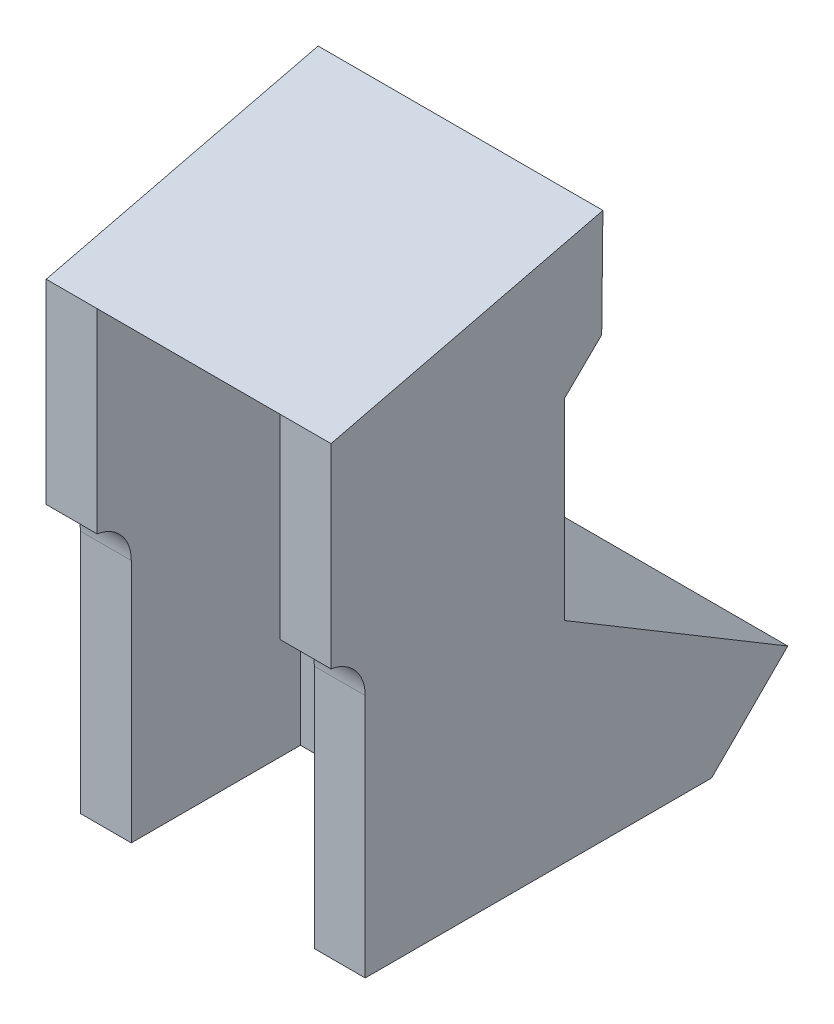
ISO-10303-21;
HEADER;
FILE_DESCRIPTION(('STEP AP214'),'2;1');
FILE_NAME('part.step','',(''),(''),'','','');
FILE_SCHEMA(('AUTOMOTIVE_DESIGN { 1 0 10303 214 1 1 1 1 }'));
ENDSEC;
DATA;
#1=APPLICATION_CONTEXT('core data for automotive mechanical design processes');
#2=APPLICATION_PROTOCOL_DEFINITION('international standard','automotive_design',2000,#1);
#3=PRODUCT_CONTEXT('',#1,'mechanical');
#4=PRODUCT('Part','Part','',(#3));
#5=PRODUCT_RELATED_PRODUCT_CATEGORY('part','',(#4));
#6=PRODUCT_DEFINITION_FORMATION('','',#4);
#7=PRODUCT_DEFINITION_CONTEXT('part definition',#1,'design');
#8=PRODUCT_DEFINITION('design','',#6,#7);
#9=PRODUCT_DEFINITION_SHAPE('','',#8);
#10=(LENGTH_UNIT() NAMED_UNIT(*) SI_UNIT(.MILLI.,.METRE.));
#11=(NAMED_UNIT(*) PLANE_ANGLE_UNIT() SI_UNIT($,.RADIAN.));
#12=(NAMED_UNIT(*) SI_UNIT($,.STERADIAN.) SOLID_ANGLE_UNIT());
#13=UNCERTAINTY_MEASURE_WITH_UNIT(LENGTH_MEASURE(1.E-05),#10,'distance_accuracy_value','');
#14=(GEOMETRIC_REPRESENTATION_CONTEXT(3) GLOBAL_UNCERTAINTY_ASSIGNED_CONTEXT((#13)) GLOBAL_UNIT_ASSIGNED_CONTEXT((#10,
#11,#12)) REPRESENTATION_CONTEXT('',''));
#15=CARTESIAN_POINT('',(0.,0.,0.));
#16=DIRECTION('',(0.,0.,1.));
#17=DIRECTION('',(1.,0.,0.));
#18=AXIS2_PLACEMENT_3D('',#15,#16,#17);
#19=CARTESIAN_POINT('',(14.,8.74131190937914,6.10391849047311));
#20=DIRECTION('',(0.,0.,-1.));
#21=DIRECTION('',(-1.,0.,0.));
#22=AXIS2_PLACEMENT_3D('',#19,#20,#21);
#23=PLANE('',#22);
#24=DIRECTION('',(-1.,0.,0.));
#25=VECTOR('',#24,1.);
#26=CARTESIAN_POINT('',(14.,-0.850340136054422,6.10391849047311));
#27=LINE('',#26,#25);
#28=CARTESIAN_POINT('',(2.5,-0.850340136054423,6.10391849047311));
#29=VERTEX_POINT('',#28);
#30=CARTESIAN_POINT('',(0.,-0.850340136054422,6.10391849047311));
#31=VERTEX_POINT('',#30);
#32=EDGE_CURVE('E241',#29,#31,#27,.T.);
#33=ORIENTED_EDGE('',*,*,#32,.F.);
#34=DIRECTION('',(0.,-1.,0.));
#35=VECTOR('',#34,1.);
#36=CARTESIAN_POINT('',(2.5,8.74131190937914,6.10391849047311));
#37=LINE('',#36,#35);
#38=CARTESIAN_POINT('',(2.5,8.74131190937914,6.10391849047311));
#39=VERTEX_POINT('',#38);
#40=EDGE_CURVE('E187',#39,#29,#37,.T.);
#41=ORIENTED_EDGE('',*,*,#40,.F.);
#42=DIRECTION('',(-1.,0.,0.));
#43=VECTOR('',#42,1.);
#44=CARTESIAN_POINT('',(14.,8.74131190937914,6.10391849047311));
#45=LINE('',#44,#43);
#46=CARTESIAN_POINT('',(0.,8.74131190937914,6.10391849047311));
#47=VERTEX_POINT('',#46);
#48=EDGE_CURVE('E245',#39,#47,#45,.T.);
#49=ORIENTED_EDGE('',*,*,#48,.T.);
#50=DIRECTION('',(0.,-1.,0.));
#51=VECTOR('',#50,1.);
#52=CARTESIAN_POINT('',(0.,8.74131190937914,6.10391849047311));
#53=LINE('',#52,#51);
#54=EDGE_CURVE('E202',#47,#31,#53,.T.);
#55=ORIENTED_EDGE('',*,*,#54,.T.);
#56=EDGE_LOOP('',(#33,#41,#49,#55));
#57=FACE_BOUND('',#56,.T.);
#58=ADVANCED_FACE('F41',(#57),#23,.F.);
#59=CARTESIAN_POINT('',(14.,-0.850340136054422,4.42176870748299));
#60=DIRECTION('',(0.,0.,-1.));
#61=DIRECTION('',(0.,1.,0.));
#62=AXIS2_PLACEMENT_3D('',#59,#60,#61);
#63=PLANE('',#62);
#64=DIRECTION('',(0.,1.,0.));
#65=VECTOR('',#64,1.);
#66=CARTESIAN_POINT('',(2.5,-0.850340136054424,4.42176870748299));
#67=LINE('',#66,#65);
#68=CARTESIAN_POINT('',(2.5,-14.8503401360544,4.42176870748299));
#69=VERTEX_POINT('',#68);
#70=CARTESIAN_POINT('',(2.5,-2.82492141813596,4.42176870748299));
#71=VERTEX_POINT('',#70);
#72=EDGE_CURVE('E161',#69,#71,#67,.T.);
#73=ORIENTED_EDGE('',*,*,#72,.T.);
#74=DIRECTION('',(-1.,0.,0.));
#75=VECTOR('',#74,1.);
#76=CARTESIAN_POINT('',(14.,-2.82492141813596,4.42176870748299));
#77=LINE('',#76,#75);
#78=CARTESIAN_POINT('',(0.,-2.82492141813596,4.42176870748299));
#79=VERTEX_POINT('',#78);
#80=EDGE_CURVE('E249',#71,#79,#77,.T.);
#81=ORIENTED_EDGE('',*,*,#80,.T.);
#82=DIRECTION('',(0.,-1.,0.));
#83=VECTOR('',#82,1.);
#84=CARTESIAN_POINT('',(0.,-0.850340136054422,4.42176870748299));
#85=LINE('',#84,#83);
#86=CARTESIAN_POINT('',(0.,-14.8503401360544,4.42176870748299));
#87=VERTEX_POINT('',#86);
#88=EDGE_CURVE('E222',#79,#87,#85,.T.);
#89=ORIENTED_EDGE('',*,*,#88,.T.);
#90=DIRECTION('',(-1.,0.,0.));
#91=VECTOR('',#90,1.);
#92=CARTESIAN_POINT('',(14.,-14.8503401360544,4.42176870748299));
#93=LINE('',#92,#91);
#94=EDGE_CURVE('E238',#69,#87,#93,.T.);
#95=ORIENTED_EDGE('',*,*,#94,.F.);
#96=EDGE_LOOP('',(#73,#81,#89,#95));
#97=FACE_BOUND('',#96,.T.);
#98=ADVANCED_FACE('F298',(#97),#63,.F.);
#99=CARTESIAN_POINT('',(14.,8.74131190937914,6.10391849047311));
#100=VERTEX_POINT('',#99);
#101=CARTESIAN_POINT('',(11.5,8.74131190937914,6.10391849047311));
#102=VERTEX_POINT('',#101);
#103=EDGE_CURVE('E246',#100,#102,#45,.T.);
#104=ORIENTED_EDGE('',*,*,#103,.T.);
#105=DIRECTION('',(0.,1.,0.));
#106=VECTOR('',#105,1.);
#107=CARTESIAN_POINT('',(11.5,8.74131190937914,6.10391849047311));
#108=LINE('',#107,#106);
#109=CARTESIAN_POINT('',(11.5,-0.850340136054423,6.10391849047311));
#110=VERTEX_POINT('',#109);
#111=EDGE_CURVE('E189',#110,#102,#108,.T.);
#112=ORIENTED_EDGE('',*,*,#111,.F.);
#113=CARTESIAN_POINT('',(14.,-0.850340136054422,6.10391849047311));
#114=VERTEX_POINT('',#113);
#115=EDGE_CURVE('E242',#114,#110,#27,.T.);
#116=ORIENTED_EDGE('',*,*,#115,.F.);
#117=DIRECTION('',(0.,-1.,0.));
#118=VECTOR('',#117,1.);
#119=CARTESIAN_POINT('',(14.,8.74131190937914,6.10391849047311));
#120=LINE('',#119,#118);
#121=EDGE_CURVE('E205',#100,#114,#120,.T.);
#122=ORIENTED_EDGE('',*,*,#121,.F.);
#123=EDGE_LOOP('',(#104,#112,#116,#122));
#124=FACE_BOUND('',#123,.T.);
#125=ADVANCED_FACE('F328',(#124),#23,.F.);
#126=DIRECTION('',(0.,-1.,0.));
#127=VECTOR('',#126,1.);
#128=CARTESIAN_POINT('',(14.,-0.850340136054422,4.42176870748299));
#129=LINE('',#128,#127);
#130=CARTESIAN_POINT('',(14.,-2.82492141813596,4.42176870748299));
#131=VERTEX_POINT('',#130);
#132=CARTESIAN_POINT('',(14.,-14.8503401360544,4.42176870748299));
#133=VERTEX_POINT('',#132);
#134=EDGE_CURVE('E208',#131,#133,#129,.T.);
#135=ORIENTED_EDGE('',*,*,#134,.F.);
#136=DIRECTION('',(-1.,0.,0.));
#137=VECTOR('',#136,1.);
#138=CARTESIAN_POINT('',(14.,-2.82492141813596,4.42176870748299));
#139=LINE('',#138,#137);
#140=CARTESIAN_POINT('',(11.5,-2.82492141813596,4.42176870748299));
#141=VERTEX_POINT('',#140);
#142=EDGE_CURVE('E252',#131,#141,#139,.T.);
#143=ORIENTED_EDGE('',*,*,#142,.T.);
#144=DIRECTION('',(0.,-1.,0.));
#145=VECTOR('',#144,1.);
#146=CARTESIAN_POINT('',(11.5,-0.850340136054422,4.42176870748299));
#147=LINE('',#146,#145);
#148=CARTESIAN_POINT('',(11.5,-14.8503401360544,4.42176870748299));
#149=VERTEX_POINT('',#148);
#150=EDGE_CURVE('E196',#141,#149,#147,.T.);
#151=ORIENTED_EDGE('',*,*,#150,.T.);
#152=EDGE_CURVE('E239',#133,#149,#93,.T.);
#153=ORIENTED_EDGE('',*,*,#152,.F.);
#154=EDGE_LOOP('',(#135,#143,#151,#153));
#155=FACE_BOUND('',#154,.T.);
#156=ADVANCED_FACE('F317',(#155),#63,.F.);
#157=CARTESIAN_POINT('',(14.,-14.8503401360544,-22.6052497412551));
#158=DIRECTION('',(0.,1.,0.));
#159=DIRECTION('',(0.,0.,1.));
#160=AXIS2_PLACEMENT_3D('',#157,#158,#159);
#161=PLANE('',#160);
#162=DIRECTION('',(0.,0.,-1.));
#163=VECTOR('',#162,1.);
#164=CARTESIAN_POINT('',(0.,-14.8503401360544,-22.6052497412551));
#165=LINE('',#164,#163);
#166=CARTESIAN_POINT('',(0.,-14.8503401360544,-12.6052497412551));
#167=VERTEX_POINT('',#166);
#168=EDGE_CURVE('E224',#87,#167,#165,.T.);
#169=ORIENTED_EDGE('',*,*,#168,.T.);
#170=DIRECTION('',(1.,0.,0.));
#171=VECTOR('',#170,1.);
#172=CARTESIAN_POINT('',(14.,-14.8503401360544,-12.6052497412551));
#173=LINE('',#172,#171);
#174=CARTESIAN_POINT('',(14.,-14.8503401360544,-12.6052497412551));
#175=VERTEX_POINT('',#174);
#176=EDGE_CURVE('E270',#167,#175,#173,.T.);
#177=ORIENTED_EDGE('',*,*,#176,.T.);
#178=DIRECTION('',(0.,0.,-1.));
#179=VECTOR('',#178,1.);
#180=CARTESIAN_POINT('',(14.,-14.8503401360544,-22.6052497412551));
#181=LINE('',#180,#179);
#182=EDGE_CURVE('E210',#133,#175,#181,.T.);
#183=ORIENTED_EDGE('',*,*,#182,.F.);
#184=ORIENTED_EDGE('',*,*,#152,.T.);
#185=DIRECTION('',(0.,0.,1.));
#186=VECTOR('',#185,1.);
#187=CARTESIAN_POINT('',(11.5,-14.8503401360544,-3.89608150952689));
#188=LINE('',#187,#186);
#189=CARTESIAN_POINT('',(11.5,-14.8503401360544,-3.89608150952689));
#190=VERTEX_POINT('',#189);
#191=EDGE_CURVE('E166',#190,#149,#188,.T.);
#192=ORIENTED_EDGE('',*,*,#191,.F.);
#193=DIRECTION('',(1.,0.,0.));
#194=VECTOR('',#193,1.);
#195=CARTESIAN_POINT('',(2.5,-14.8503401360544,-3.89608150952689));
#196=LINE('',#195,#194);
#197=CARTESIAN_POINT('',(2.5,-14.8503401360544,-3.89608150952689));
#198=VERTEX_POINT('',#197);
#199=EDGE_CURVE('E173',#198,#190,#196,.T.);
#200=ORIENTED_EDGE('',*,*,#199,.F.);
#201=DIRECTION('',(0.,0.,1.));
#202=VECTOR('',#201,1.);
#203=CARTESIAN_POINT('',(2.5,-14.8503401360544,-3.89608150952689));
#204=LINE('',#203,#202);
#205=EDGE_CURVE('E155',#198,#69,#204,.T.);
#206=ORIENTED_EDGE('',*,*,#205,.T.);
#207=ORIENTED_EDGE('',*,*,#94,.T.);
#208=EDGE_LOOP('',(#169,#177,#183,#184,#192,#200,#206,#207));
#209=FACE_BOUND('',#208,.T.);
#210=ADVANCED_FACE('F179',(#209),#161,.F.);
#211=CARTESIAN_POINT('',(14.,-4.52781626860019,-5.37414965986395));
#212=DIRECTION('',(0.,-0.857847135561487,0.513904944526662));
#213=DIRECTION('',(0.,-0.513904944526662,-0.857847135561487));
#214=AXIS2_PLACEMENT_3D('',#211,#212,#213);
#215=PLANE('',#214);
#216=DIRECTION('',(0.,0.513904944526662,0.857847135561487));
#217=VECTOR('',#216,1.);
#218=CARTESIAN_POINT('',(14.,-4.52781626860019,-5.37414965986395));
#219=LINE('',#218,#217);
#220=CARTESIAN_POINT('',(14.,-11.1040003127998,-16.3515895645098));
#221=VERTEX_POINT('',#220);
#222=CARTESIAN_POINT('',(14.,-4.52781626860019,-5.37414965986395));
#223=VERTEX_POINT('',#222);
#224=EDGE_CURVE('E213',#221,#223,#219,.T.);
#225=ORIENTED_EDGE('',*,*,#224,.F.);
#226=DIRECTION('',(-1.,0.,0.));
#227=VECTOR('',#226,1.);
#228=CARTESIAN_POINT('',(14.,-11.1040003127998,-16.3515895645098));
#229=LINE('',#228,#227);
#230=CARTESIAN_POINT('',(0.,-11.1040003127998,-16.3515895645098));
#231=VERTEX_POINT('',#230);
#232=EDGE_CURVE('E263',#221,#231,#229,.T.);
#233=ORIENTED_EDGE('',*,*,#232,.T.);
#234=DIRECTION('',(0.,0.513904944526662,0.857847135561487));
#235=VECTOR('',#234,1.);
#236=CARTESIAN_POINT('',(0.,-4.52781626860019,-5.37414965986395));
#237=LINE('',#236,#235);
#238=CARTESIAN_POINT('',(0.,-4.52781626860019,-5.37414965986395));
#239=VERTEX_POINT('',#238);
#240=EDGE_CURVE('E226',#231,#239,#237,.T.);
#241=ORIENTED_EDGE('',*,*,#240,.T.);
#242=DIRECTION('',(-1.,0.,0.));
#243=VECTOR('',#242,1.);
#244=CARTESIAN_POINT('',(14.,-4.52781626860019,-5.37414965986395));
#245=LINE('',#244,#243);
#246=EDGE_CURVE('E235',#223,#239,#245,.T.);
#247=ORIENTED_EDGE('',*,*,#246,.F.);
#248=EDGE_LOOP('',(#225,#233,#241,#247));
#249=FACE_BOUND('',#248,.T.);
#250=ADVANCED_FACE('F308',(#249),#215,.F.);
#251=CARTESIAN_POINT('',(14.,4.92796604432498,-5.37414965986395));
#252=DIRECTION('',(0.,0.,1.));
#253=DIRECTION('',(0.,-1.,0.));
#254=AXIS2_PLACEMENT_3D('',#251,#252,#253);
#255=PLANE('',#254);
#256=DIRECTION('',(0.,1.,0.));
#257=VECTOR('',#256,1.);
#258=CARTESIAN_POINT('',(0.,4.92796604432498,-5.37414965986395));
#259=LINE('',#258,#257);
#260=CARTESIAN_POINT('',(0.,4.92796604432498,-5.37414965986395));
#261=VERTEX_POINT('',#260);
#262=EDGE_CURVE('E228',#239,#261,#259,.T.);
#263=ORIENTED_EDGE('',*,*,#262,.T.);
#264=DIRECTION('',(-1.,0.,0.));
#265=VECTOR('',#264,1.);
#266=CARTESIAN_POINT('',(14.,4.92796604432498,-5.37414965986395));
#267=LINE('',#266,#265);
#268=CARTESIAN_POINT('',(14.,4.92796604432498,-5.37414965986395));
#269=VERTEX_POINT('',#268);
#270=EDGE_CURVE('E219',#269,#261,#267,.T.);
#271=ORIENTED_EDGE('',*,*,#270,.F.);
#272=DIRECTION('',(0.,1.,0.));
#273=VECTOR('',#272,1.);
#274=CARTESIAN_POINT('',(14.,4.92796604432498,-5.37414965986395));
#275=LINE('',#274,#273);
#276=EDGE_CURVE('E215',#223,#269,#275,.T.);
#277=ORIENTED_EDGE('',*,*,#276,.F.);
#278=ORIENTED_EDGE('',*,*,#246,.T.);
#279=EDGE_LOOP('',(#263,#271,#277,#278));
#280=FACE_BOUND('',#279,.T.);
#281=ADVANCED_FACE('F358',(#280),#255,.F.);
#282=CARTESIAN_POINT('',(14.,13.7074829931973,-14.3537414965986));
#283=DIRECTION('',(0.,0.71502770122186,0.699096121063035));
#284=DIRECTION('',(0.,-0.699096121063036,0.71502770122186));
#285=AXIS2_PLACEMENT_3D('',#282,#283,#284);
#286=PLANE('',#285);
#287=DIRECTION('',(0.,0.699096121063036,-0.71502770122186));
#288=VECTOR('',#287,1.);
#289=CARTESIAN_POINT('',(0.,13.7074829931973,-14.3537414965986));
#290=LINE('',#289,#288);
#291=CARTESIAN_POINT('',(0.,6.7165217825669,-7.20346448438));
#292=VERTEX_POINT('',#291);
#293=EDGE_CURVE('E230',#261,#292,#290,.T.);
#294=ORIENTED_EDGE('',*,*,#293,.T.);
#295=DIRECTION('',(1.,0.,0.));
#296=VECTOR('',#295,1.);
#297=CARTESIAN_POINT('',(14.,6.7165217825669,-7.20346448438));
#298=LINE('',#297,#296);
#299=CARTESIAN_POINT('',(14.,6.7165217825669,-7.20346448438));
#300=VERTEX_POINT('',#299);
#301=EDGE_CURVE('E11',#292,#300,#298,.T.);
#302=ORIENTED_EDGE('',*,*,#301,.T.);
#303=DIRECTION('',(0.,0.699096121063036,-0.71502770122186));
#304=VECTOR('',#303,1.);
#305=CARTESIAN_POINT('',(14.,13.7074829931973,-14.3537414965986));
#306=LINE('',#305,#304);
#307=EDGE_CURVE('E217',#269,#300,#306,.T.);
#308=ORIENTED_EDGE('',*,*,#307,.F.);
#309=ORIENTED_EDGE('',*,*,#270,.T.);
#310=EDGE_LOOP('',(#294,#302,#308,#309));
#311=FACE_BOUND('',#310,.T.);
#312=ADVANCED_FACE('F361',(#311),#286,.F.);
#313=CARTESIAN_POINT('',(14.,9.14965986394558,4.42176870748299));
#314=DIRECTION('',(0.,-0.971776769571021,-0.23590233174369));
#315=DIRECTION('',(0.,0.23590233174369,-0.971776769571022));
#316=AXIS2_PLACEMENT_3D('',#313,#314,#315);
#317=PLANE('',#316);
#318=DIRECTION('',(0.,-0.23590233174369,0.971776769571021));
#319=VECTOR('',#318,1.);
#320=CARTESIAN_POINT('',(14.,9.14965986394558,4.42176870748299));
#321=LINE('',#320,#319);
#322=CARTESIAN_POINT('',(14.,11.9861390747884,-7.26283222076515));
#323=VERTEX_POINT('',#322);
#324=EDGE_CURVE('E203',#323,#100,#321,.T.);
#325=ORIENTED_EDGE('',*,*,#324,.F.);
#326=DIRECTION('',(-1.,0.,0.));
#327=VECTOR('',#326,1.);
#328=CARTESIAN_POINT('',(14.,11.9861390747884,-7.26283222076515));
#329=LINE('',#328,#327);
#330=CARTESIAN_POINT('',(0.,11.9861390747884,-7.26283222076515));
#331=VERTEX_POINT('',#330);
#332=EDGE_CURVE('E50',#323,#331,#329,.T.);
#333=ORIENTED_EDGE('',*,*,#332,.T.);
#334=DIRECTION('',(0.,-0.23590233174369,0.971776769571021));
#335=VECTOR('',#334,1.);
#336=CARTESIAN_POINT('',(0.,9.14965986394558,4.42176870748299));
#337=LINE('',#336,#335);
#338=EDGE_CURVE('E206',#331,#47,#337,.T.);
#339=ORIENTED_EDGE('',*,*,#338,.T.);
#340=ORIENTED_EDGE('',*,*,#48,.F.);
#341=DIRECTION('',(-1.,0.,0.));
#342=VECTOR('',#341,1.);
#343=CARTESIAN_POINT('',(2.5,8.74131190937914,6.10391849047311));
#344=LINE('',#343,#342);
#345=EDGE_CURVE('E176',#102,#39,#344,.T.);
#346=ORIENTED_EDGE('',*,*,#345,.F.);
#347=ORIENTED_EDGE('',*,*,#103,.F.);
#348=EDGE_LOOP('',(#325,#333,#339,#340,#346,#347));
#349=FACE_BOUND('',#348,.T.);
#350=ADVANCED_FACE('F278',(#349),#317,.F.);
#351=CARTESIAN_POINT('',(14.,0.,0.));
#352=DIRECTION('',(1.,0.,0.));
#353=DIRECTION('',(0.,0.,-1.));
#354=AXIS2_PLACEMENT_3D('',#351,#352,#353);
#355=PLANE('',#354);
#356=ORIENTED_EDGE('',*,*,#182,.T.);
#357=DIRECTION('',(0.,-0.707106781186547,0.707106781186548));
#358=VECTOR('',#357,1.);
#359=CARTESIAN_POINT('',(14.,-13.7277949386548,-13.7277949386547));
#360=LINE('',#359,#358);
#361=EDGE_CURVE('E273',#175,#221,#360,.F.);
#362=ORIENTED_EDGE('',*,*,#361,.T.);
#363=ORIENTED_EDGE('',*,*,#224,.T.);
#364=ORIENTED_EDGE('',*,*,#276,.T.);
#365=ORIENTED_EDGE('',*,*,#307,.T.);
#366=DIRECTION('',(0.,-0.99993654417509,0.0112653283653238));
#367=VECTOR('',#366,1.);
#368=CARTESIAN_POINT('',(14.,-0.0802918655673758,-7.1268912877805));
#369=LINE('',#368,#367);
#370=EDGE_CURVE('E62',#300,#323,#369,.F.);
#371=ORIENTED_EDGE('',*,*,#370,.T.);
#372=ORIENTED_EDGE('',*,*,#324,.T.);
#373=ORIENTED_EDGE('',*,*,#121,.T.);
#374=CARTESIAN_POINT('',(14.,-2.82492141813596,6.42176870748299));
#375=DIRECTION('',(1.,0.,0.));
#376=DIRECTION('',(0.,0.,-1.));
#377=AXIS2_PLACEMENT_3D('',#374,#375,#376);
#378=CIRCLE('',#377,2.);
#379=EDGE_CURVE('E261',#114,#131,#378,.F.);
#380=ORIENTED_EDGE('',*,*,#379,.T.);
#381=ORIENTED_EDGE('',*,*,#134,.T.);
#382=EDGE_LOOP('',(#356,#362,#363,#364,#365,#371,#372,#373,#380,#381));
#383=FACE_BOUND('',#382,.T.);
#384=ADVANCED_FACE('F311',(#383),#355,.T.);
#385=CARTESIAN_POINT('',(0.,0.,0.));
#386=DIRECTION('',(1.,0.,0.));
#387=DIRECTION('',(0.,0.,-1.));
#388=AXIS2_PLACEMENT_3D('',#385,#386,#387);
#389=PLANE('',#388);
#390=ORIENTED_EDGE('',*,*,#240,.F.);
#391=DIRECTION('',(0.,0.707106781186547,-0.707106781186548));
#392=VECTOR('',#391,1.);
#393=CARTESIAN_POINT('',(0.,-11.1040003127998,-16.3515895645098));
#394=LINE('',#393,#392);
#395=EDGE_CURVE('E268',#231,#167,#394,.F.);
#396=ORIENTED_EDGE('',*,*,#395,.T.);
#397=ORIENTED_EDGE('',*,*,#168,.F.);
#398=ORIENTED_EDGE('',*,*,#88,.F.);
#399=CARTESIAN_POINT('',(0.,-2.82492141813596,6.42176870748299));
#400=DIRECTION('',(1.,0.,0.));
#401=DIRECTION('',(0.,0.,-1.));
#402=AXIS2_PLACEMENT_3D('',#399,#400,#401);
#403=CIRCLE('',#402,2.);
#404=EDGE_CURVE('E255',#79,#31,#403,.T.);
#405=ORIENTED_EDGE('',*,*,#404,.T.);
#406=ORIENTED_EDGE('',*,*,#54,.F.);
#407=ORIENTED_EDGE('',*,*,#338,.F.);
#408=DIRECTION('',(0.,0.99993654417509,-0.0112653283653238));
#409=VECTOR('',#408,1.);
#410=CARTESIAN_POINT('',(0.,11.9861390747884,-7.26283222076515));
#411=LINE('',#410,#409);
#412=EDGE_CURVE('E266',#331,#292,#411,.F.);
#413=ORIENTED_EDGE('',*,*,#412,.T.);
#414=ORIENTED_EDGE('',*,*,#293,.F.);
#415=ORIENTED_EDGE('',*,*,#262,.F.);
#416=EDGE_LOOP('',(#390,#396,#397,#398,#405,#406,#407,#413,#414,#415));
#417=FACE_BOUND('',#416,.T.);
#418=ADVANCED_FACE('F286',(#417),#389,.F.);
#419=CARTESIAN_POINT('',(2.5,8.74131190937914,-3.89608150952689));
#420=DIRECTION('',(-1.,0.,0.));
#421=DIRECTION('',(0.,-1.,0.));
#422=AXIS2_PLACEMENT_3D('',#419,#420,#421);
#423=PLANE('',#422);
#424=ORIENTED_EDGE('',*,*,#72,.F.);
#425=ORIENTED_EDGE('',*,*,#205,.F.);
#426=DIRECTION('',(0.,-1.,0.));
#427=VECTOR('',#426,1.);
#428=CARTESIAN_POINT('',(2.5,8.74131190937914,-3.89608150952689));
#429=LINE('',#428,#427);
#430=CARTESIAN_POINT('',(2.5,8.74131190937914,-3.89608150952689));
#431=VERTEX_POINT('',#430);
#432=EDGE_CURVE('E158',#431,#198,#429,.T.);
#433=ORIENTED_EDGE('',*,*,#432,.F.);
#434=DIRECTION('',(0.,0.,1.));
#435=VECTOR('',#434,1.);
#436=CARTESIAN_POINT('',(2.5,8.74131190937914,-3.89608150952689));
#437=LINE('',#436,#435);
#438=EDGE_CURVE('E194',#431,#39,#437,.T.);
#439=ORIENTED_EDGE('',*,*,#438,.T.);
#440=ORIENTED_EDGE('',*,*,#40,.T.);
#441=CARTESIAN_POINT('',(2.5,-2.82492141813596,6.42176870748299));
#442=DIRECTION('',(-1.,0.,0.));
#443=DIRECTION('',(0.,-1.,0.));
#444=AXIS2_PLACEMENT_3D('',#441,#442,#443);
#445=CIRCLE('',#444,2.);
#446=EDGE_CURVE('E257',#29,#71,#445,.T.);
#447=ORIENTED_EDGE('',*,*,#446,.T.);
#448=EDGE_LOOP('',(#424,#425,#433,#439,#440,#447));
#449=FACE_BOUND('',#448,.T.);
#450=ADVANCED_FACE('F157',(#449),#423,.F.);
#451=CARTESIAN_POINT('',(11.5,8.74131190937914,-3.89608150952689));
#452=DIRECTION('',(1.,0.,0.));
#453=DIRECTION('',(0.,1.,0.));
#454=AXIS2_PLACEMENT_3D('',#451,#452,#453);
#455=PLANE('',#454);
#456=ORIENTED_EDGE('',*,*,#111,.T.);
#457=DIRECTION('',(0.,0.,1.));
#458=VECTOR('',#457,1.);
#459=CARTESIAN_POINT('',(11.5,8.74131190937914,-3.89608150952689));
#460=LINE('',#459,#458);
#461=CARTESIAN_POINT('',(11.5,8.74131190937914,-3.89608150952689));
#462=VERTEX_POINT('',#461);
#463=EDGE_CURVE('E197',#462,#102,#460,.T.);
#464=ORIENTED_EDGE('',*,*,#463,.F.);
#465=DIRECTION('',(0.,1.,0.));
#466=VECTOR('',#465,1.);
#467=CARTESIAN_POINT('',(11.5,8.74131190937914,-3.89608150952689));
#468=LINE('',#467,#466);
#469=EDGE_CURVE('E182',#190,#462,#468,.T.);
#470=ORIENTED_EDGE('',*,*,#469,.F.);
#471=ORIENTED_EDGE('',*,*,#191,.T.);
#472=ORIENTED_EDGE('',*,*,#150,.F.);
#473=CARTESIAN_POINT('',(11.5,-2.82492141813596,6.42176870748299));
#474=DIRECTION('',(1.,0.,0.));
#475=DIRECTION('',(0.,1.,0.));
#476=AXIS2_PLACEMENT_3D('',#473,#474,#475);
#477=CIRCLE('',#476,2.);
#478=EDGE_CURVE('E259',#141,#110,#477,.T.);
#479=ORIENTED_EDGE('',*,*,#478,.T.);
#480=EDGE_LOOP('',(#456,#464,#470,#471,#472,#479));
#481=FACE_BOUND('',#480,.T.);
#482=ADVANCED_FACE('F321',(#481),#455,.F.);
#483=CARTESIAN_POINT('',(2.5,8.74131190937914,-3.89608150952689));
#484=DIRECTION('',(0.,1.,0.));
#485=DIRECTION('',(0.,0.,1.));
#486=AXIS2_PLACEMENT_3D('',#483,#484,#485);
#487=PLANE('',#486);
#488=ORIENTED_EDGE('',*,*,#345,.T.);
#489=ORIENTED_EDGE('',*,*,#438,.F.);
#490=DIRECTION('',(-1.,0.,0.));
#491=VECTOR('',#490,1.);
#492=CARTESIAN_POINT('',(2.5,8.74131190937914,-3.89608150952689));
#493=LINE('',#492,#491);
#494=EDGE_CURVE('E167',#462,#431,#493,.T.);
#495=ORIENTED_EDGE('',*,*,#494,.F.);
#496=ORIENTED_EDGE('',*,*,#463,.T.);
#497=EDGE_LOOP('',(#488,#489,#495,#496));
#498=FACE_BOUND('',#497,.T.);
#499=ADVANCED_FACE('F323',(#498),#487,.F.);
#500=CARTESIAN_POINT('',(0.,0.,-3.89608150952689));
#501=DIRECTION('',(0.,0.,1.));
#502=DIRECTION('',(1.,0.,0.));
#503=AXIS2_PLACEMENT_3D('',#500,#501,#502);
#504=PLANE('',#503);
#505=ORIENTED_EDGE('',*,*,#432,.T.);
#506=ORIENTED_EDGE('',*,*,#199,.T.);
#507=ORIENTED_EDGE('',*,*,#469,.T.);
#508=ORIENTED_EDGE('',*,*,#494,.T.);
#509=EDGE_LOOP('',(#505,#506,#507,#508));
#510=FACE_BOUND('',#509,.T.);
#511=ADVANCED_FACE('F171',(#510),#504,.T.);
#512=CARTESIAN_POINT('',(14.,-2.82492141813596,6.42176870748299));
#513=DIRECTION('',(-1.,0.,0.));
#514=DIRECTION('',(0.,0.,1.));
#515=AXIS2_PLACEMENT_3D('',#512,#513,#514);
#516=CYLINDRICAL_SURFACE('',#515,2.);
#517=ORIENTED_EDGE('',*,*,#446,.F.);
#518=ORIENTED_EDGE('',*,*,#32,.T.);
#519=ORIENTED_EDGE('',*,*,#404,.F.);
#520=ORIENTED_EDGE('',*,*,#80,.F.);
#521=EDGE_LOOP('',(#517,#518,#519,#520));
#522=FACE_BOUND('',#521,.T.);
#523=ADVANCED_FACE('F295',(#522),#516,.F.);
#524=CARTESIAN_POINT('',(14.,-2.82492141813596,6.42176870748299));
#525=DIRECTION('',(-1.,0.,0.));
#526=DIRECTION('',(0.,0.,1.));
#527=AXIS2_PLACEMENT_3D('',#524,#525,#526);
#528=CYLINDRICAL_SURFACE('',#527,2.);
#529=ORIENTED_EDGE('',*,*,#379,.F.);
#530=ORIENTED_EDGE('',*,*,#115,.T.);
#531=ORIENTED_EDGE('',*,*,#478,.F.);
#532=ORIENTED_EDGE('',*,*,#142,.F.);
#533=EDGE_LOOP('',(#529,#530,#531,#532));
#534=FACE_BOUND('',#533,.T.);
#535=ADVANCED_FACE('F332',(#534),#528,.F.);
#536=CARTESIAN_POINT('',(14.,-11.1040003127998,-16.3515895645098));
#537=DIRECTION('',(0.,0.707106781186548,0.707106781186547));
#538=DIRECTION('',(-1.,0.,0.));
#539=AXIS2_PLACEMENT_3D('',#536,#537,#538);
#540=PLANE('',#539);
#541=ORIENTED_EDGE('',*,*,#361,.F.);
#542=ORIENTED_EDGE('',*,*,#176,.F.);
#543=ORIENTED_EDGE('',*,*,#395,.F.);
#544=ORIENTED_EDGE('',*,*,#232,.F.);
#545=EDGE_LOOP('',(#541,#542,#543,#544));
#546=FACE_BOUND('',#545,.T.);
#547=ADVANCED_FACE('F305',(#546),#540,.F.);
#548=CARTESIAN_POINT('',(14.,11.9861390747884,-7.26283222076515));
#549=DIRECTION('',(0.,0.0112653283653238,0.99993654417509));
#550=DIRECTION('',(-1.,0.,0.));
#551=AXIS2_PLACEMENT_3D('',#548,#549,#550);
#552=PLANE('',#551);
#553=ORIENTED_EDGE('',*,*,#370,.F.);
#554=ORIENTED_EDGE('',*,*,#301,.F.);
#555=ORIENTED_EDGE('',*,*,#412,.F.);
#556=ORIENTED_EDGE('',*,*,#332,.F.);
#557=EDGE_LOOP('',(#553,#554,#555,#556));
#558=FACE_BOUND('',#557,.T.);
#559=ADVANCED_FACE('F44',(#558),#552,.F.);
#560=CLOSED_SHELL('',(#58,#98,#125,#156,#210,#250,#281,#312,#350,#384,#418,#450,#482,#499,#511,
#523,#535,#547,#559));
#561=MANIFOLD_SOLID_BREP('B2',#560);
#562=ADVANCED_BREP_SHAPE_REPRESENTATION('',(#18,#561),#14);
#563=SHAPE_DEFINITION_REPRESENTATION(#9,#562);
ENDSEC;
END-ISO-10303-21;
